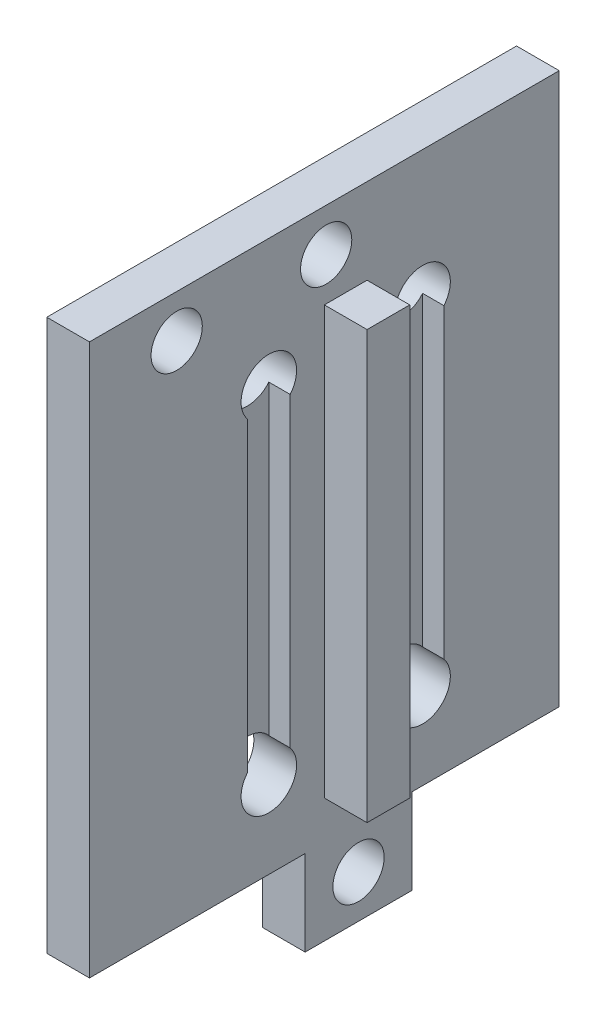
ISO-10303-21;
HEADER;
FILE_DESCRIPTION(('STEP AP214'),'2;1');
FILE_NAME('part.step','',(''),(''),'','','');
FILE_SCHEMA(('AUTOMOTIVE_DESIGN { 1 0 10303 214 1 1 1 1 }'));
ENDSEC;
DATA;
#1=APPLICATION_CONTEXT('core data for automotive mechanical design processes');
#2=APPLICATION_PROTOCOL_DEFINITION('international standard','automotive_design',2000,#1);
#3=PRODUCT_CONTEXT('',#1,'mechanical');
#4=PRODUCT('Part','Part','',(#3));
#5=PRODUCT_RELATED_PRODUCT_CATEGORY('part','',(#4));
#6=PRODUCT_DEFINITION_FORMATION('','',#4);
#7=PRODUCT_DEFINITION_CONTEXT('part definition',#1,'design');
#8=PRODUCT_DEFINITION('design','',#6,#7);
#9=PRODUCT_DEFINITION_SHAPE('','',#8);
#10=(LENGTH_UNIT() NAMED_UNIT(*) SI_UNIT(.MILLI.,.METRE.));
#11=(NAMED_UNIT(*) PLANE_ANGLE_UNIT() SI_UNIT($,.RADIAN.));
#12=(NAMED_UNIT(*) SI_UNIT($,.STERADIAN.) SOLID_ANGLE_UNIT());
#13=UNCERTAINTY_MEASURE_WITH_UNIT(LENGTH_MEASURE(1.E-05),#10,'distance_accuracy_value','');
#14=(GEOMETRIC_REPRESENTATION_CONTEXT(3) GLOBAL_UNCERTAINTY_ASSIGNED_CONTEXT((#13)) GLOBAL_UNIT_ASSIGNED_CONTEXT((#10,
#11,#12)) REPRESENTATION_CONTEXT('',''));
#15=CARTESIAN_POINT('',(0.,0.,0.));
#16=DIRECTION('',(0.,0.,1.));
#17=DIRECTION('',(1.,0.,0.));
#18=AXIS2_PLACEMENT_3D('',#15,#16,#17);
#19=CARTESIAN_POINT('',(1.,-1.,-3.2));
#20=DIRECTION('',(-1.,0.,0.));
#21=DIRECTION('',(0.,0.,1.));
#22=AXIS2_PLACEMENT_3D('',#19,#20,#21);
#23=CYLINDRICAL_SURFACE('',#22,0.65);
#24=CARTESIAN_POINT('',(0.,-1.,-3.2));
#25=DIRECTION('',(1.,0.,0.));
#26=DIRECTION('',(0.,0.,-1.));
#27=AXIS2_PLACEMENT_3D('',#24,#25,#26);
#28=CIRCLE('',#27,0.65);
#29=CARTESIAN_POINT('',(0.,-1.,-3.85));
#30=VERTEX_POINT('',#29);
#31=EDGE_CURVE('E337',#30,#30,#28,.T.);
#32=ORIENTED_EDGE('',*,*,#31,.F.);
#33=EDGE_LOOP('',(#32));
#34=FACE_BOUND('',#33,.T.);
#35=CARTESIAN_POINT('',(0.5,-1.,-3.2));
#36=DIRECTION('',(1.,0.,0.));
#37=DIRECTION('',(0.,0.,-1.));
#38=AXIS2_PLACEMENT_3D('',#35,#36,#37);
#39=CIRCLE('',#38,0.65);
#40=CARTESIAN_POINT('',(0.5,-1.41533119314588,-2.69999999999998));
#41=VERTEX_POINT('',#40);
#42=CARTESIAN_POINT('',(0.5,-1.41533119314588,-3.70000000000002));
#43=VERTEX_POINT('',#42);
#44=EDGE_CURVE('E185',#41,#43,#39,.T.);
#45=ORIENTED_EDGE('',*,*,#44,.T.);
#46=DIRECTION('',(1.,0.,0.));
#47=VECTOR('',#46,1.);
#48=CARTESIAN_POINT('',(0.5,-1.41533119314588,-3.70000000000002));
#49=LINE('',#48,#47);
#50=CARTESIAN_POINT('',(1.,-1.41533119314588,-3.70000000000002));
#51=VERTEX_POINT('',#50);
#52=EDGE_CURVE('E206',#43,#51,#49,.T.);
#53=ORIENTED_EDGE('',*,*,#52,.T.);
#54=CARTESIAN_POINT('',(1.,-1.,-3.2));
#55=DIRECTION('',(1.,0.,0.));
#56=DIRECTION('',(0.,0.,-1.));
#57=AXIS2_PLACEMENT_3D('',#54,#55,#56);
#58=CIRCLE('',#57,0.65);
#59=CARTESIAN_POINT('',(1.,-1.41533119314588,-2.69999999999998));
#60=VERTEX_POINT('',#59);
#61=EDGE_CURVE('E294',#51,#60,#58,.T.);
#62=ORIENTED_EDGE('',*,*,#61,.T.);
#63=DIRECTION('',(1.,0.,0.));
#64=VECTOR('',#63,1.);
#65=CARTESIAN_POINT('',(0.5,-1.41533119314588,-2.69999999999998));
#66=LINE('',#65,#64);
#67=EDGE_CURVE('E52',#41,#60,#66,.T.);
#68=ORIENTED_EDGE('',*,*,#67,.F.);
#69=EDGE_LOOP('',(#45,#53,#62,#68));
#70=FACE_BOUND('',#69,.T.);
#71=ADVANCED_FACE('F37',(#34,#70),#23,.F.);
#72=CARTESIAN_POINT('',(1.,-9.,-3.2));
#73=DIRECTION('',(-1.,0.,0.));
#74=DIRECTION('',(0.,0.,1.));
#75=AXIS2_PLACEMENT_3D('',#72,#73,#74);
#76=CYLINDRICAL_SURFACE('',#75,0.649999999999999);
#77=CARTESIAN_POINT('',(1.,-9.,-3.2));
#78=DIRECTION('',(1.,0.,0.));
#79=DIRECTION('',(0.,0.,-1.));
#80=AXIS2_PLACEMENT_3D('',#77,#78,#79);
#81=CIRCLE('',#80,0.649999999999999);
#82=CARTESIAN_POINT('',(1.,-8.58466880685413,-2.69999999999998));
#83=VERTEX_POINT('',#82);
#84=CARTESIAN_POINT('',(1.,-8.58466880685413,-3.70000000000003));
#85=VERTEX_POINT('',#84);
#86=EDGE_CURVE('E292',#83,#85,#81,.T.);
#87=ORIENTED_EDGE('',*,*,#86,.T.);
#88=DIRECTION('',(-1.,0.,0.));
#89=VECTOR('',#88,1.);
#90=CARTESIAN_POINT('',(1.,-8.58466880685413,-3.70000000000003));
#91=LINE('',#90,#89);
#92=CARTESIAN_POINT('',(0.5,-8.58466880685413,-3.70000000000003));
#93=VERTEX_POINT('',#92);
#94=EDGE_CURVE('E221',#85,#93,#91,.T.);
#95=ORIENTED_EDGE('',*,*,#94,.T.);
#96=CARTESIAN_POINT('',(0.5,-9.,-3.2));
#97=DIRECTION('',(1.,0.,0.));
#98=DIRECTION('',(0.,0.,-1.));
#99=AXIS2_PLACEMENT_3D('',#96,#97,#98);
#100=CIRCLE('',#99,0.649999999999999);
#101=CARTESIAN_POINT('',(0.5,-8.58466880685413,-2.69999999999998));
#102=VERTEX_POINT('',#101);
#103=EDGE_CURVE('E11',#93,#102,#100,.T.);
#104=ORIENTED_EDGE('',*,*,#103,.T.);
#105=DIRECTION('',(-1.,0.,0.));
#106=VECTOR('',#105,1.);
#107=CARTESIAN_POINT('',(1.,-8.58466880685413,-2.69999999999998));
#108=LINE('',#107,#106);
#109=EDGE_CURVE('E199',#83,#102,#108,.T.);
#110=ORIENTED_EDGE('',*,*,#109,.F.);
#111=EDGE_LOOP('',(#87,#95,#104,#110));
#112=FACE_BOUND('',#111,.T.);
#113=CARTESIAN_POINT('',(0.,-9.,-3.2));
#114=DIRECTION('',(1.,0.,0.));
#115=DIRECTION('',(0.,0.,-1.));
#116=AXIS2_PLACEMENT_3D('',#113,#114,#115);
#117=CIRCLE('',#116,0.649999999999999);
#118=CARTESIAN_POINT('',(0.,-9.,-3.85));
#119=VERTEX_POINT('',#118);
#120=EDGE_CURVE('E334',#119,#119,#117,.T.);
#121=ORIENTED_EDGE('',*,*,#120,.F.);
#122=EDGE_LOOP('',(#121));
#123=FACE_BOUND('',#122,.T.);
#124=ADVANCED_FACE('F384',(#112,#123),#76,.F.);
#125=CARTESIAN_POINT('',(1.,-0.999999999999971,-6.8));
#126=DIRECTION('',(-1.,0.,0.));
#127=DIRECTION('',(0.,0.,1.));
#128=AXIS2_PLACEMENT_3D('',#125,#126,#127);
#129=CYLINDRICAL_SURFACE('',#128,0.65);
#130=CARTESIAN_POINT('',(0.,-0.999999999999971,-6.8));
#131=DIRECTION('',(1.,0.,0.));
#132=DIRECTION('',(0.,0.,-1.));
#133=AXIS2_PLACEMENT_3D('',#130,#131,#132);
#134=CIRCLE('',#133,0.65);
#135=CARTESIAN_POINT('',(0.,-0.999999999999971,-7.45));
#136=VERTEX_POINT('',#135);
#137=EDGE_CURVE('E331',#136,#136,#134,.T.);
#138=ORIENTED_EDGE('',*,*,#137,.F.);
#139=EDGE_LOOP('',(#138));
#140=FACE_BOUND('',#139,.T.);
#141=CARTESIAN_POINT('',(0.5,-0.999999999999971,-6.8));
#142=DIRECTION('',(1.,0.,0.));
#143=DIRECTION('',(0.,0.,-1.));
#144=AXIS2_PLACEMENT_3D('',#141,#142,#143);
#145=CIRCLE('',#144,0.65);
#146=CARTESIAN_POINT('',(0.5,-1.41533119314587,-6.3));
#147=VERTEX_POINT('',#146);
#148=CARTESIAN_POINT('',(0.5,-1.41533119314587,-7.3));
#149=VERTEX_POINT('',#148);
#150=EDGE_CURVE('E177',#147,#149,#145,.T.);
#151=ORIENTED_EDGE('',*,*,#150,.T.);
#152=DIRECTION('',(1.,0.,0.));
#153=VECTOR('',#152,1.);
#154=CARTESIAN_POINT('',(0.5,-1.41533119314587,-7.3));
#155=LINE('',#154,#153);
#156=CARTESIAN_POINT('',(1.,-1.41533119314587,-7.3));
#157=VERTEX_POINT('',#156);
#158=EDGE_CURVE('E197',#149,#157,#155,.T.);
#159=ORIENTED_EDGE('',*,*,#158,.T.);
#160=CARTESIAN_POINT('',(1.,-0.999999999999971,-6.8));
#161=DIRECTION('',(1.,0.,0.));
#162=DIRECTION('',(0.,0.,-1.));
#163=AXIS2_PLACEMENT_3D('',#160,#161,#162);
#164=CIRCLE('',#163,0.65);
#165=CARTESIAN_POINT('',(1.,-1.41533119314587,-6.3));
#166=VERTEX_POINT('',#165);
#167=EDGE_CURVE('E196',#157,#166,#164,.T.);
#168=ORIENTED_EDGE('',*,*,#167,.T.);
#169=DIRECTION('',(1.,0.,0.));
#170=VECTOR('',#169,1.);
#171=CARTESIAN_POINT('',(0.5,-1.41533119314587,-6.3));
#172=LINE('',#171,#170);
#173=EDGE_CURVE('E60',#147,#166,#172,.T.);
#174=ORIENTED_EDGE('',*,*,#173,.F.);
#175=EDGE_LOOP('',(#151,#159,#168,#174));
#176=FACE_BOUND('',#175,.T.);
#177=ADVANCED_FACE('F194',(#140,#176),#129,.F.);
#178=CARTESIAN_POINT('',(1.,-9.,-6.8));
#179=DIRECTION('',(-1.,0.,0.));
#180=DIRECTION('',(0.,0.,1.));
#181=AXIS2_PLACEMENT_3D('',#178,#179,#180);
#182=CYLINDRICAL_SURFACE('',#181,0.65);
#183=CARTESIAN_POINT('',(1.,-9.,-6.8));
#184=DIRECTION('',(1.,0.,0.));
#185=DIRECTION('',(0.,0.,-1.));
#186=AXIS2_PLACEMENT_3D('',#183,#184,#185);
#187=CIRCLE('',#186,0.65);
#188=CARTESIAN_POINT('',(1.,-8.5846688068541,-6.3));
#189=VERTEX_POINT('',#188);
#190=CARTESIAN_POINT('',(1.,-8.5846688068541,-7.3));
#191=VERTEX_POINT('',#190);
#192=EDGE_CURVE('E289',#189,#191,#187,.T.);
#193=ORIENTED_EDGE('',*,*,#192,.T.);
#194=DIRECTION('',(-1.,0.,0.));
#195=VECTOR('',#194,1.);
#196=CARTESIAN_POINT('',(1.,-8.5846688068541,-7.3));
#197=LINE('',#196,#195);
#198=CARTESIAN_POINT('',(0.5,-8.5846688068541,-7.3));
#199=VERTEX_POINT('',#198);
#200=EDGE_CURVE('E186',#191,#199,#197,.T.);
#201=ORIENTED_EDGE('',*,*,#200,.T.);
#202=CARTESIAN_POINT('',(0.5,-9.,-6.8));
#203=DIRECTION('',(1.,0.,0.));
#204=DIRECTION('',(0.,0.,-1.));
#205=AXIS2_PLACEMENT_3D('',#202,#203,#204);
#206=CIRCLE('',#205,0.65);
#207=CARTESIAN_POINT('',(0.5,-8.5846688068541,-6.3));
#208=VERTEX_POINT('',#207);
#209=EDGE_CURVE('E45',#199,#208,#206,.T.);
#210=ORIENTED_EDGE('',*,*,#209,.T.);
#211=DIRECTION('',(-1.,0.,0.));
#212=VECTOR('',#211,1.);
#213=CARTESIAN_POINT('',(1.,-8.5846688068541,-6.3));
#214=LINE('',#213,#212);
#215=EDGE_CURVE('E190',#189,#208,#214,.T.);
#216=ORIENTED_EDGE('',*,*,#215,.F.);
#217=EDGE_LOOP('',(#193,#201,#210,#216));
#218=FACE_BOUND('',#217,.T.);
#219=CARTESIAN_POINT('',(0.,-9.,-6.8));
#220=DIRECTION('',(1.,0.,0.));
#221=DIRECTION('',(0.,0.,-1.));
#222=AXIS2_PLACEMENT_3D('',#219,#220,#221);
#223=CIRCLE('',#222,0.65);
#224=CARTESIAN_POINT('',(0.,-9.,-7.45));
#225=VERTEX_POINT('',#224);
#226=EDGE_CURVE('E328',#225,#225,#223,.T.);
#227=ORIENTED_EDGE('',*,*,#226,.F.);
#228=EDGE_LOOP('',(#227));
#229=FACE_BOUND('',#228,.T.);
#230=ADVANCED_FACE('F360',(#218,#229),#182,.F.);
#231=CARTESIAN_POINT('',(1.,0.,0.));
#232=DIRECTION('',(1.,0.,0.));
#233=DIRECTION('',(0.,0.,-1.));
#234=AXIS2_PLACEMENT_3D('',#231,#232,#233);
#235=PLANE('',#234);
#236=DIRECTION('',(0.,0.,1.));
#237=VECTOR('',#236,1.);
#238=CARTESIAN_POINT('',(1.,-10.,0.));
#239=LINE('',#238,#237);
#240=CARTESIAN_POINT('',(1.,-10.,-5.5));
#241=VERTEX_POINT('',#240);
#242=CARTESIAN_POINT('',(1.,-10.,-4.5));
#243=VERTEX_POINT('',#242);
#244=EDGE_CURVE('E229',#241,#243,#239,.T.);
#245=ORIENTED_EDGE('',*,*,#244,.T.);
#246=DIRECTION('',(0.,1.,0.));
#247=VECTOR('',#246,1.);
#248=CARTESIAN_POINT('',(1.,0.,-4.5));
#249=LINE('',#248,#247);
#250=CARTESIAN_POINT('',(1.,0.,-4.5));
#251=VERTEX_POINT('',#250);
#252=EDGE_CURVE('E243',#243,#251,#249,.T.);
#253=ORIENTED_EDGE('',*,*,#252,.T.);
#254=DIRECTION('',(0.,0.,1.));
#255=VECTOR('',#254,1.);
#256=CARTESIAN_POINT('',(1.,0.,0.));
#257=LINE('',#256,#255);
#258=CARTESIAN_POINT('',(1.,0.,-5.5));
#259=VERTEX_POINT('',#258);
#260=EDGE_CURVE('E245',#259,#251,#257,.T.);
#261=ORIENTED_EDGE('',*,*,#260,.F.);
#262=DIRECTION('',(0.,1.,0.));
#263=VECTOR('',#262,1.);
#264=CARTESIAN_POINT('',(1.,0.,-5.5));
#265=LINE('',#264,#263);
#266=EDGE_CURVE('E234',#241,#259,#265,.T.);
#267=ORIENTED_EDGE('',*,*,#266,.F.);
#268=EDGE_LOOP('',(#245,#253,#261,#267));
#269=FACE_BOUND('',#268,.T.);
#270=DIRECTION('',(0.,0.,-1.));
#271=VECTOR('',#270,1.);
#272=CARTESIAN_POINT('',(1.,-10.9,0.));
#273=LINE('',#272,#271);
#274=CARTESIAN_POINT('',(1.,-10.9,-6.55));
#275=VERTEX_POINT('',#274);
#276=CARTESIAN_POINT('',(1.,-10.9,-10.));
#277=VERTEX_POINT('',#276);
#278=EDGE_CURVE('E262',#275,#277,#273,.T.);
#279=ORIENTED_EDGE('',*,*,#278,.T.);
#280=DIRECTION('',(0.,1.,0.));
#281=VECTOR('',#280,1.);
#282=CARTESIAN_POINT('',(1.,0.,-10.));
#283=LINE('',#282,#281);
#284=CARTESIAN_POINT('',(1.,2.,-10.));
#285=VERTEX_POINT('',#284);
#286=EDGE_CURVE('E265',#277,#285,#283,.T.);
#287=ORIENTED_EDGE('',*,*,#286,.T.);
#288=DIRECTION('',(0.,0.,-1.));
#289=VECTOR('',#288,1.);
#290=CARTESIAN_POINT('',(1.,2.,0.));
#291=LINE('',#290,#289);
#292=CARTESIAN_POINT('',(1.,2.,1.));
#293=VERTEX_POINT('',#292);
#294=EDGE_CURVE('E268',#293,#285,#291,.T.);
#295=ORIENTED_EDGE('',*,*,#294,.F.);
#296=DIRECTION('',(0.,-1.,0.));
#297=VECTOR('',#296,1.);
#298=CARTESIAN_POINT('',(1.,0.,1.));
#299=LINE('',#298,#297);
#300=CARTESIAN_POINT('',(1.,-10.9,0.999999999999998));
#301=VERTEX_POINT('',#300);
#302=EDGE_CURVE('E271',#293,#301,#299,.T.);
#303=ORIENTED_EDGE('',*,*,#302,.T.);
#304=DIRECTION('',(0.,0.,1.));
#305=VECTOR('',#304,1.);
#306=CARTESIAN_POINT('',(1.,-10.9,0.));
#307=LINE('',#306,#305);
#308=CARTESIAN_POINT('',(1.,-10.9,-4.05));
#309=VERTEX_POINT('',#308);
#310=EDGE_CURVE('E273',#309,#301,#307,.T.);
#311=ORIENTED_EDGE('',*,*,#310,.F.);
#312=DIRECTION('',(0.,1.,0.));
#313=VECTOR('',#312,1.);
#314=CARTESIAN_POINT('',(1.,0.,-4.05));
#315=LINE('',#314,#313);
#316=CARTESIAN_POINT('',(1.,-12.9,-4.05));
#317=VERTEX_POINT('',#316);
#318=EDGE_CURVE('E276',#317,#309,#315,.T.);
#319=ORIENTED_EDGE('',*,*,#318,.F.);
#320=DIRECTION('',(0.,0.,-1.));
#321=VECTOR('',#320,1.);
#322=CARTESIAN_POINT('',(1.,-12.9,0.));
#323=LINE('',#322,#321);
#324=CARTESIAN_POINT('',(1.,-12.9,-6.55));
#325=VERTEX_POINT('',#324);
#326=EDGE_CURVE('E279',#317,#325,#323,.T.);
#327=ORIENTED_EDGE('',*,*,#326,.T.);
#328=DIRECTION('',(0.,1.,0.));
#329=VECTOR('',#328,1.);
#330=CARTESIAN_POINT('',(1.,0.,-6.55));
#331=LINE('',#330,#329);
#332=EDGE_CURVE('E281',#325,#275,#331,.T.);
#333=ORIENTED_EDGE('',*,*,#332,.T.);
#334=EDGE_LOOP('',(#279,#287,#295,#303,#311,#319,#327,#333));
#335=FACE_BOUND('',#334,.T.);
#336=CARTESIAN_POINT('',(1.,0.999999999999999,-4.54229405691225));
#337=DIRECTION('',(1.,0.,0.));
#338=DIRECTION('',(0.,0.,-1.));
#339=AXIS2_PLACEMENT_3D('',#336,#337,#338);
#340=CIRCLE('',#339,0.6);
#341=CARTESIAN_POINT('',(1.,0.999999999999999,-5.14229405691225));
#342=VERTEX_POINT('',#341);
#343=EDGE_CURVE('E283',#342,#342,#340,.T.);
#344=ORIENTED_EDGE('',*,*,#343,.F.);
#345=EDGE_LOOP('',(#344));
#346=FACE_BOUND('',#345,.T.);
#347=CARTESIAN_POINT('',(1.,1.,-1.04229405691225));
#348=DIRECTION('',(1.,0.,0.));
#349=DIRECTION('',(0.,0.,-1.));
#350=AXIS2_PLACEMENT_3D('',#347,#348,#349);
#351=CIRCLE('',#350,0.6);
#352=CARTESIAN_POINT('',(1.,1.,-1.64229405691225));
#353=VERTEX_POINT('',#352);
#354=EDGE_CURVE('E286',#353,#353,#351,.T.);
#355=ORIENTED_EDGE('',*,*,#354,.F.);
#356=EDGE_LOOP('',(#355));
#357=FACE_BOUND('',#356,.T.);
#358=CARTESIAN_POINT('',(1.,-11.9,-5.3));
#359=DIRECTION('',(1.,0.,0.));
#360=DIRECTION('',(0.,0.,-1.));
#361=AXIS2_PLACEMENT_3D('',#358,#359,#360);
#362=CIRCLE('',#361,0.6);
#363=CARTESIAN_POINT('',(1.,-11.9,-5.9));
#364=VERTEX_POINT('',#363);
#365=EDGE_CURVE('E297',#364,#364,#362,.T.);
#366=ORIENTED_EDGE('',*,*,#365,.F.);
#367=EDGE_LOOP('',(#366));
#368=FACE_BOUND('',#367,.T.);
#369=ORIENTED_EDGE('',*,*,#61,.F.);
#370=DIRECTION('',(0.,-1.,0.));
#371=VECTOR('',#370,1.);
#372=CARTESIAN_POINT('',(1.,-1.41533119314588,-3.70000000000002));
#373=LINE('',#372,#371);
#374=EDGE_CURVE('E209',#51,#85,#373,.T.);
#375=ORIENTED_EDGE('',*,*,#374,.T.);
#376=ORIENTED_EDGE('',*,*,#86,.F.);
#377=DIRECTION('',(0.,-1.,0.));
#378=VECTOR('',#377,1.);
#379=CARTESIAN_POINT('',(1.,-1.41533119314588,-2.69999999999998));
#380=LINE('',#379,#378);
#381=EDGE_CURVE('E212',#60,#83,#380,.T.);
#382=ORIENTED_EDGE('',*,*,#381,.F.);
#383=EDGE_LOOP('',(#369,#375,#376,#382));
#384=FACE_BOUND('',#383,.T.);
#385=ORIENTED_EDGE('',*,*,#167,.F.);
#386=DIRECTION('',(0.,-1.,0.));
#387=VECTOR('',#386,1.);
#388=CARTESIAN_POINT('',(1.,-1.41533119314587,-7.3));
#389=LINE('',#388,#387);
#390=EDGE_CURVE('E191',#157,#191,#389,.T.);
#391=ORIENTED_EDGE('',*,*,#390,.T.);
#392=ORIENTED_EDGE('',*,*,#192,.F.);
#393=DIRECTION('',(0.,-1.,0.));
#394=VECTOR('',#393,1.);
#395=CARTESIAN_POINT('',(1.,-1.41533119314587,-6.3));
#396=LINE('',#395,#394);
#397=EDGE_CURVE('E215',#166,#189,#396,.T.);
#398=ORIENTED_EDGE('',*,*,#397,.F.);
#399=EDGE_LOOP('',(#385,#391,#392,#398));
#400=FACE_BOUND('',#399,.T.);
#401=ADVANCED_FACE('F368',(#269,#335,#346,#357,#368,#384,#400),#235,.T.);
#402=CARTESIAN_POINT('',(1.,-10.9,0.));
#403=DIRECTION('',(0.,1.,0.));
#404=DIRECTION('',(0.,0.,1.));
#405=AXIS2_PLACEMENT_3D('',#402,#403,#404);
#406=PLANE('',#405);
#407=DIRECTION('',(0.,0.,-1.));
#408=VECTOR('',#407,1.);
#409=CARTESIAN_POINT('',(0.,-10.9,0.));
#410=LINE('',#409,#408);
#411=CARTESIAN_POINT('',(0.,-10.9,-6.55));
#412=VERTEX_POINT('',#411);
#413=CARTESIAN_POINT('',(0.,-10.9,-10.));
#414=VERTEX_POINT('',#413);
#415=EDGE_CURVE('E253',#412,#414,#410,.T.);
#416=ORIENTED_EDGE('',*,*,#415,.T.);
#417=DIRECTION('',(-1.,0.,0.));
#418=VECTOR('',#417,1.);
#419=CARTESIAN_POINT('',(1.,-10.9,-10.));
#420=LINE('',#419,#418);
#421=EDGE_CURVE('E357',#277,#414,#420,.T.);
#422=ORIENTED_EDGE('',*,*,#421,.F.);
#423=ORIENTED_EDGE('',*,*,#278,.F.);
#424=DIRECTION('',(-1.,0.,0.));
#425=VECTOR('',#424,1.);
#426=CARTESIAN_POINT('',(1.,-10.9,-6.55));
#427=LINE('',#426,#425);
#428=EDGE_CURVE('E300',#275,#412,#427,.T.);
#429=ORIENTED_EDGE('',*,*,#428,.T.);
#430=EDGE_LOOP('',(#416,#422,#423,#429));
#431=FACE_BOUND('',#430,.T.);
#432=ADVANCED_FACE('F39',(#431),#406,.F.);
#433=CARTESIAN_POINT('',(1.,0.,-10.));
#434=DIRECTION('',(0.,0.,1.));
#435=DIRECTION('',(1.,0.,0.));
#436=AXIS2_PLACEMENT_3D('',#433,#434,#435);
#437=PLANE('',#436);
#438=DIRECTION('',(0.,1.,0.));
#439=VECTOR('',#438,1.);
#440=CARTESIAN_POINT('',(0.,0.,-10.));
#441=LINE('',#440,#439);
#442=CARTESIAN_POINT('',(0.,2.,-10.));
#443=VERTEX_POINT('',#442);
#444=EDGE_CURVE('E303',#414,#443,#441,.T.);
#445=ORIENTED_EDGE('',*,*,#444,.T.);
#446=DIRECTION('',(-1.,0.,0.));
#447=VECTOR('',#446,1.);
#448=CARTESIAN_POINT('',(1.,2.,-10.));
#449=LINE('',#448,#447);
#450=EDGE_CURVE('E355',#285,#443,#449,.T.);
#451=ORIENTED_EDGE('',*,*,#450,.F.);
#452=ORIENTED_EDGE('',*,*,#286,.F.);
#453=ORIENTED_EDGE('',*,*,#421,.T.);
#454=EDGE_LOOP('',(#445,#451,#452,#453));
#455=FACE_BOUND('',#454,.T.);
#456=ADVANCED_FACE('F377',(#455),#437,.F.);
#457=CARTESIAN_POINT('',(1.,2.,0.));
#458=DIRECTION('',(0.,1.,0.));
#459=DIRECTION('',(0.,0.,1.));
#460=AXIS2_PLACEMENT_3D('',#457,#458,#459);
#461=PLANE('',#460);
#462=DIRECTION('',(0.,0.,-1.));
#463=VECTOR('',#462,1.);
#464=CARTESIAN_POINT('',(0.,2.,0.));
#465=LINE('',#464,#463);
#466=CARTESIAN_POINT('',(0.,2.,1.));
#467=VERTEX_POINT('',#466);
#468=EDGE_CURVE('E306',#467,#443,#465,.T.);
#469=ORIENTED_EDGE('',*,*,#468,.F.);
#470=DIRECTION('',(-1.,0.,0.));
#471=VECTOR('',#470,1.);
#472=CARTESIAN_POINT('',(1.,2.,1.));
#473=LINE('',#472,#471);
#474=EDGE_CURVE('E353',#293,#467,#473,.T.);
#475=ORIENTED_EDGE('',*,*,#474,.F.);
#476=ORIENTED_EDGE('',*,*,#294,.T.);
#477=ORIENTED_EDGE('',*,*,#450,.T.);
#478=EDGE_LOOP('',(#469,#475,#476,#477));
#479=FACE_BOUND('',#478,.T.);
#480=ADVANCED_FACE('F427',(#479),#461,.T.);
#481=CARTESIAN_POINT('',(1.,0.,1.));
#482=DIRECTION('',(0.,0.,-1.));
#483=DIRECTION('',(0.,1.,0.));
#484=AXIS2_PLACEMENT_3D('',#481,#482,#483);
#485=PLANE('',#484);
#486=DIRECTION('',(0.,-1.,0.));
#487=VECTOR('',#486,1.);
#488=CARTESIAN_POINT('',(0.,0.,1.));
#489=LINE('',#488,#487);
#490=CARTESIAN_POINT('',(0.,-10.9,0.999999999999998));
#491=VERTEX_POINT('',#490);
#492=EDGE_CURVE('E309',#467,#491,#489,.T.);
#493=ORIENTED_EDGE('',*,*,#492,.T.);
#494=DIRECTION('',(-1.,0.,0.));
#495=VECTOR('',#494,1.);
#496=CARTESIAN_POINT('',(1.,-10.9,0.999999999999998));
#497=LINE('',#496,#495);
#498=EDGE_CURVE('E351',#301,#491,#497,.T.);
#499=ORIENTED_EDGE('',*,*,#498,.F.);
#500=ORIENTED_EDGE('',*,*,#302,.F.);
#501=ORIENTED_EDGE('',*,*,#474,.T.);
#502=EDGE_LOOP('',(#493,#499,#500,#501));
#503=FACE_BOUND('',#502,.T.);
#504=ADVANCED_FACE('F423',(#503),#485,.F.);
#505=CARTESIAN_POINT('',(1.,-10.9,0.));
#506=DIRECTION('',(0.,-1.,0.));
#507=DIRECTION('',(0.,0.,-1.));
#508=AXIS2_PLACEMENT_3D('',#505,#506,#507);
#509=PLANE('',#508);
#510=DIRECTION('',(0.,0.,1.));
#511=VECTOR('',#510,1.);
#512=CARTESIAN_POINT('',(0.,-10.9,0.));
#513=LINE('',#512,#511);
#514=CARTESIAN_POINT('',(0.,-10.9,-4.05));
#515=VERTEX_POINT('',#514);
#516=EDGE_CURVE('E312',#515,#491,#513,.T.);
#517=ORIENTED_EDGE('',*,*,#516,.F.);
#518=DIRECTION('',(-1.,0.,0.));
#519=VECTOR('',#518,1.);
#520=CARTESIAN_POINT('',(1.,-10.9,-4.05));
#521=LINE('',#520,#519);
#522=EDGE_CURVE('E349',#309,#515,#521,.T.);
#523=ORIENTED_EDGE('',*,*,#522,.F.);
#524=ORIENTED_EDGE('',*,*,#310,.T.);
#525=ORIENTED_EDGE('',*,*,#498,.T.);
#526=EDGE_LOOP('',(#517,#523,#524,#525));
#527=FACE_BOUND('',#526,.T.);
#528=ADVANCED_FACE('F419',(#527),#509,.T.);
#529=CARTESIAN_POINT('',(1.,0.,-4.05));
#530=DIRECTION('',(0.,0.,1.));
#531=DIRECTION('',(1.,0.,0.));
#532=AXIS2_PLACEMENT_3D('',#529,#530,#531);
#533=PLANE('',#532);
#534=DIRECTION('',(0.,1.,0.));
#535=VECTOR('',#534,1.);
#536=CARTESIAN_POINT('',(0.,0.,-4.05));
#537=LINE('',#536,#535);
#538=CARTESIAN_POINT('',(0.,-12.9,-4.05));
#539=VERTEX_POINT('',#538);
#540=EDGE_CURVE('E315',#539,#515,#537,.T.);
#541=ORIENTED_EDGE('',*,*,#540,.F.);
#542=DIRECTION('',(-1.,0.,0.));
#543=VECTOR('',#542,1.);
#544=CARTESIAN_POINT('',(1.,-12.9,-4.05));
#545=LINE('',#544,#543);
#546=EDGE_CURVE('E347',#317,#539,#545,.T.);
#547=ORIENTED_EDGE('',*,*,#546,.F.);
#548=ORIENTED_EDGE('',*,*,#318,.T.);
#549=ORIENTED_EDGE('',*,*,#522,.T.);
#550=EDGE_LOOP('',(#541,#547,#548,#549));
#551=FACE_BOUND('',#550,.T.);
#552=ADVANCED_FACE('F415',(#551),#533,.T.);
#553=CARTESIAN_POINT('',(1.,-12.9,0.));
#554=DIRECTION('',(0.,1.,0.));
#555=DIRECTION('',(0.,0.,1.));
#556=AXIS2_PLACEMENT_3D('',#553,#554,#555);
#557=PLANE('',#556);
#558=DIRECTION('',(0.,0.,-1.));
#559=VECTOR('',#558,1.);
#560=CARTESIAN_POINT('',(0.,-12.9,0.));
#561=LINE('',#560,#559);
#562=CARTESIAN_POINT('',(0.,-12.9,-6.55));
#563=VERTEX_POINT('',#562);
#564=EDGE_CURVE('E318',#539,#563,#561,.T.);
#565=ORIENTED_EDGE('',*,*,#564,.T.);
#566=DIRECTION('',(-1.,0.,0.));
#567=VECTOR('',#566,1.);
#568=CARTESIAN_POINT('',(1.,-12.9,-6.55));
#569=LINE('',#568,#567);
#570=EDGE_CURVE('E344',#325,#563,#569,.T.);
#571=ORIENTED_EDGE('',*,*,#570,.F.);
#572=ORIENTED_EDGE('',*,*,#326,.F.);
#573=ORIENTED_EDGE('',*,*,#546,.T.);
#574=EDGE_LOOP('',(#565,#571,#572,#573));
#575=FACE_BOUND('',#574,.T.);
#576=ADVANCED_FACE('F404',(#575),#557,.F.);
#577=CARTESIAN_POINT('',(1.,1.,-1.04229405691225));
#578=DIRECTION('',(-1.,0.,0.));
#579=DIRECTION('',(0.,0.,1.));
#580=AXIS2_PLACEMENT_3D('',#577,#578,#579);
#581=CYLINDRICAL_SURFACE('',#580,0.6);
#582=ORIENTED_EDGE('',*,*,#354,.T.);
#583=EDGE_LOOP('',(#582));
#584=FACE_BOUND('',#583,.T.);
#585=CARTESIAN_POINT('',(0.,1.,-1.04229405691225));
#586=DIRECTION('',(1.,0.,0.));
#587=DIRECTION('',(0.,0.,-1.));
#588=AXIS2_PLACEMENT_3D('',#585,#586,#587);
#589=CIRCLE('',#588,0.6);
#590=CARTESIAN_POINT('',(0.,1.,-1.64229405691225));
#591=VERTEX_POINT('',#590);
#592=EDGE_CURVE('E325',#591,#591,#589,.T.);
#593=ORIENTED_EDGE('',*,*,#592,.F.);
#594=EDGE_LOOP('',(#593));
#595=FACE_BOUND('',#594,.T.);
#596=ADVANCED_FACE('F400',(#584,#595),#581,.F.);
#597=CARTESIAN_POINT('',(1.,0.999999999999999,-4.54229405691225));
#598=DIRECTION('',(-1.,0.,0.));
#599=DIRECTION('',(0.,0.,1.));
#600=AXIS2_PLACEMENT_3D('',#597,#598,#599);
#601=CYLINDRICAL_SURFACE('',#600,0.6);
#602=ORIENTED_EDGE('',*,*,#343,.T.);
#603=EDGE_LOOP('',(#602));
#604=FACE_BOUND('',#603,.T.);
#605=CARTESIAN_POINT('',(0.,0.999999999999999,-4.54229405691225));
#606=DIRECTION('',(1.,0.,0.));
#607=DIRECTION('',(0.,0.,-1.));
#608=AXIS2_PLACEMENT_3D('',#605,#606,#607);
#609=CIRCLE('',#608,0.6);
#610=CARTESIAN_POINT('',(0.,0.999999999999999,-5.14229405691225));
#611=VERTEX_POINT('',#610);
#612=EDGE_CURVE('E322',#611,#611,#609,.T.);
#613=ORIENTED_EDGE('',*,*,#612,.F.);
#614=EDGE_LOOP('',(#613));
#615=FACE_BOUND('',#614,.T.);
#616=ADVANCED_FACE('F403',(#604,#615),#601,.F.);
#617=CARTESIAN_POINT('',(1.,0.,-6.55));
#618=DIRECTION('',(0.,0.,1.));
#619=DIRECTION('',(1.,0.,0.));
#620=AXIS2_PLACEMENT_3D('',#617,#618,#619);
#621=PLANE('',#620);
#622=DIRECTION('',(0.,1.,0.));
#623=VECTOR('',#622,1.);
#624=CARTESIAN_POINT('',(0.,0.,-6.55));
#625=LINE('',#624,#623);
#626=EDGE_CURVE('E320',#563,#412,#625,.T.);
#627=ORIENTED_EDGE('',*,*,#626,.T.);
#628=ORIENTED_EDGE('',*,*,#428,.F.);
#629=ORIENTED_EDGE('',*,*,#332,.F.);
#630=ORIENTED_EDGE('',*,*,#570,.T.);
#631=EDGE_LOOP('',(#627,#628,#629,#630));
#632=FACE_BOUND('',#631,.T.);
#633=ADVANCED_FACE('F408',(#632),#621,.F.);
#634=CARTESIAN_POINT('',(1.,-11.9,-5.3));
#635=DIRECTION('',(-1.,0.,0.));
#636=DIRECTION('',(0.,0.,1.));
#637=AXIS2_PLACEMENT_3D('',#634,#635,#636);
#638=CYLINDRICAL_SURFACE('',#637,0.6);
#639=ORIENTED_EDGE('',*,*,#365,.T.);
#640=EDGE_LOOP('',(#639));
#641=FACE_BOUND('',#640,.T.);
#642=CARTESIAN_POINT('',(0.,-11.9,-5.3));
#643=DIRECTION('',(1.,0.,0.));
#644=DIRECTION('',(0.,0.,-1.));
#645=AXIS2_PLACEMENT_3D('',#642,#643,#644);
#646=CIRCLE('',#645,0.6);
#647=CARTESIAN_POINT('',(0.,-11.9,-5.9));
#648=VERTEX_POINT('',#647);
#649=EDGE_CURVE('E266',#648,#648,#646,.T.);
#650=ORIENTED_EDGE('',*,*,#649,.F.);
#651=EDGE_LOOP('',(#650));
#652=FACE_BOUND('',#651,.T.);
#653=ADVANCED_FACE('F395',(#641,#652),#638,.F.);
#654=CARTESIAN_POINT('',(0.,0.,0.));
#655=DIRECTION('',(1.,0.,0.));
#656=DIRECTION('',(0.,0.,-1.));
#657=AXIS2_PLACEMENT_3D('',#654,#655,#656);
#658=PLANE('',#657);
#659=ORIENTED_EDGE('',*,*,#415,.F.);
#660=ORIENTED_EDGE('',*,*,#626,.F.);
#661=ORIENTED_EDGE('',*,*,#564,.F.);
#662=ORIENTED_EDGE('',*,*,#540,.T.);
#663=ORIENTED_EDGE('',*,*,#516,.T.);
#664=ORIENTED_EDGE('',*,*,#492,.F.);
#665=ORIENTED_EDGE('',*,*,#468,.T.);
#666=ORIENTED_EDGE('',*,*,#444,.F.);
#667=EDGE_LOOP('',(#659,#660,#661,#662,#663,#664,#665,#666));
#668=FACE_BOUND('',#667,.T.);
#669=ORIENTED_EDGE('',*,*,#612,.T.);
#670=EDGE_LOOP('',(#669));
#671=FACE_BOUND('',#670,.T.);
#672=ORIENTED_EDGE('',*,*,#592,.T.);
#673=EDGE_LOOP('',(#672));
#674=FACE_BOUND('',#673,.T.);
#675=ORIENTED_EDGE('',*,*,#226,.T.);
#676=EDGE_LOOP('',(#675));
#677=FACE_BOUND('',#676,.T.);
#678=ORIENTED_EDGE('',*,*,#137,.T.);
#679=EDGE_LOOP('',(#678));
#680=FACE_BOUND('',#679,.T.);
#681=ORIENTED_EDGE('',*,*,#120,.T.);
#682=EDGE_LOOP('',(#681));
#683=FACE_BOUND('',#682,.T.);
#684=ORIENTED_EDGE('',*,*,#31,.T.);
#685=EDGE_LOOP('',(#684));
#686=FACE_BOUND('',#685,.T.);
#687=ORIENTED_EDGE('',*,*,#649,.T.);
#688=EDGE_LOOP('',(#687));
#689=FACE_BOUND('',#688,.T.);
#690=ADVANCED_FACE('F441',(#668,#671,#674,#677,#680,#683,#686,#689),#658,.F.);
#691=CARTESIAN_POINT('',(2.,-10.,0.));
#692=DIRECTION('',(0.,-1.,0.));
#693=DIRECTION('',(0.,0.,-1.));
#694=AXIS2_PLACEMENT_3D('',#691,#692,#693);
#695=PLANE('',#694);
#696=ORIENTED_EDGE('',*,*,#244,.F.);
#697=DIRECTION('',(-1.,0.,0.));
#698=VECTOR('',#697,1.);
#699=CARTESIAN_POINT('',(2.,-10.,-5.5));
#700=LINE('',#699,#698);
#701=CARTESIAN_POINT('',(2.,-10.,-5.5));
#702=VERTEX_POINT('',#701);
#703=EDGE_CURVE('E250',#702,#241,#700,.T.);
#704=ORIENTED_EDGE('',*,*,#703,.F.);
#705=DIRECTION('',(0.,0.,1.));
#706=VECTOR('',#705,1.);
#707=CARTESIAN_POINT('',(2.,-10.,0.));
#708=LINE('',#707,#706);
#709=CARTESIAN_POINT('',(2.,-10.,-4.5));
#710=VERTEX_POINT('',#709);
#711=EDGE_CURVE('E230',#702,#710,#708,.T.);
#712=ORIENTED_EDGE('',*,*,#711,.T.);
#713=DIRECTION('',(-1.,0.,0.));
#714=VECTOR('',#713,1.);
#715=CARTESIAN_POINT('',(2.,-10.,-4.5));
#716=LINE('',#715,#714);
#717=EDGE_CURVE('E241',#710,#243,#716,.T.);
#718=ORIENTED_EDGE('',*,*,#717,.T.);
#719=EDGE_LOOP('',(#696,#704,#712,#718));
#720=FACE_BOUND('',#719,.T.);
#721=ADVANCED_FACE('F495',(#720),#695,.T.);
#722=CARTESIAN_POINT('',(2.,0.,-5.5));
#723=DIRECTION('',(0.,0.,1.));
#724=DIRECTION('',(0.,-1.,0.));
#725=AXIS2_PLACEMENT_3D('',#722,#723,#724);
#726=PLANE('',#725);
#727=ORIENTED_EDGE('',*,*,#266,.T.);
#728=DIRECTION('',(-1.,0.,0.));
#729=VECTOR('',#728,1.);
#730=CARTESIAN_POINT('',(2.,0.,-5.5));
#731=LINE('',#730,#729);
#732=CARTESIAN_POINT('',(2.,0.,-5.5));
#733=VERTEX_POINT('',#732);
#734=EDGE_CURVE('E254',#733,#259,#731,.T.);
#735=ORIENTED_EDGE('',*,*,#734,.F.);
#736=DIRECTION('',(0.,1.,0.));
#737=VECTOR('',#736,1.);
#738=CARTESIAN_POINT('',(2.,0.,-5.5));
#739=LINE('',#738,#737);
#740=EDGE_CURVE('E239',#702,#733,#739,.T.);
#741=ORIENTED_EDGE('',*,*,#740,.F.);
#742=ORIENTED_EDGE('',*,*,#703,.T.);
#743=EDGE_LOOP('',(#727,#735,#741,#742));
#744=FACE_BOUND('',#743,.T.);
#745=ADVANCED_FACE('F491',(#744),#726,.F.);
#746=CARTESIAN_POINT('',(2.,0.,0.));
#747=DIRECTION('',(0.,-1.,0.));
#748=DIRECTION('',(0.,0.,-1.));
#749=AXIS2_PLACEMENT_3D('',#746,#747,#748);
#750=PLANE('',#749);
#751=ORIENTED_EDGE('',*,*,#260,.T.);
#752=DIRECTION('',(-1.,0.,0.));
#753=VECTOR('',#752,1.);
#754=CARTESIAN_POINT('',(2.,0.,-4.5));
#755=LINE('',#754,#753);
#756=CARTESIAN_POINT('',(2.,0.,-4.5));
#757=VERTEX_POINT('',#756);
#758=EDGE_CURVE('E257',#757,#251,#755,.T.);
#759=ORIENTED_EDGE('',*,*,#758,.F.);
#760=DIRECTION('',(0.,0.,1.));
#761=VECTOR('',#760,1.);
#762=CARTESIAN_POINT('',(2.,0.,0.));
#763=LINE('',#762,#761);
#764=EDGE_CURVE('E237',#733,#757,#763,.T.);
#765=ORIENTED_EDGE('',*,*,#764,.F.);
#766=ORIENTED_EDGE('',*,*,#734,.T.);
#767=EDGE_LOOP('',(#751,#759,#765,#766));
#768=FACE_BOUND('',#767,.T.);
#769=ADVANCED_FACE('F494',(#768),#750,.F.);
#770=CARTESIAN_POINT('',(2.,0.,-4.5));
#771=DIRECTION('',(0.,0.,1.));
#772=DIRECTION('',(0.,-1.,0.));
#773=AXIS2_PLACEMENT_3D('',#770,#771,#772);
#774=PLANE('',#773);
#775=ORIENTED_EDGE('',*,*,#252,.F.);
#776=ORIENTED_EDGE('',*,*,#717,.F.);
#777=DIRECTION('',(0.,1.,0.));
#778=VECTOR('',#777,1.);
#779=CARTESIAN_POINT('',(2.,0.,-4.5));
#780=LINE('',#779,#778);
#781=EDGE_CURVE('E233',#710,#757,#780,.T.);
#782=ORIENTED_EDGE('',*,*,#781,.T.);
#783=ORIENTED_EDGE('',*,*,#758,.T.);
#784=EDGE_LOOP('',(#775,#776,#782,#783));
#785=FACE_BOUND('',#784,.T.);
#786=ADVANCED_FACE('F489',(#785),#774,.T.);
#787=CARTESIAN_POINT('',(2.,0.,0.));
#788=DIRECTION('',(-1.,0.,0.));
#789=DIRECTION('',(0.,0.,1.));
#790=AXIS2_PLACEMENT_3D('',#787,#788,#789);
#791=PLANE('',#790);
#792=ORIENTED_EDGE('',*,*,#711,.F.);
#793=ORIENTED_EDGE('',*,*,#740,.T.);
#794=ORIENTED_EDGE('',*,*,#764,.T.);
#795=ORIENTED_EDGE('',*,*,#781,.F.);
#796=EDGE_LOOP('',(#792,#793,#794,#795));
#797=FACE_BOUND('',#796,.T.);
#798=ADVANCED_FACE('F482',(#797),#791,.F.);
#799=CARTESIAN_POINT('',(0.5,-1.41533119314588,-3.70000000000002));
#800=DIRECTION('',(0.,0.,1.));
#801=DIRECTION('',(0.,-1.,0.));
#802=AXIS2_PLACEMENT_3D('',#799,#800,#801);
#803=PLANE('',#802);
#804=ORIENTED_EDGE('',*,*,#374,.F.);
#805=ORIENTED_EDGE('',*,*,#52,.F.);
#806=DIRECTION('',(0.,-1.,0.));
#807=VECTOR('',#806,1.);
#808=CARTESIAN_POINT('',(0.5,-1.41533119314588,-3.70000000000002));
#809=LINE('',#808,#807);
#810=EDGE_CURVE('E205',#43,#93,#809,.T.);
#811=ORIENTED_EDGE('',*,*,#810,.T.);
#812=ORIENTED_EDGE('',*,*,#94,.F.);
#813=EDGE_LOOP('',(#804,#805,#811,#812));
#814=FACE_BOUND('',#813,.T.);
#815=ADVANCED_FACE('F468',(#814),#803,.T.);
#816=CARTESIAN_POINT('',(0.5,-1.41533119314588,-2.69999999999998));
#817=DIRECTION('',(0.,0.,1.));
#818=DIRECTION('',(0.,-1.,0.));
#819=AXIS2_PLACEMENT_3D('',#816,#817,#818);
#820=PLANE('',#819);
#821=ORIENTED_EDGE('',*,*,#109,.T.);
#822=DIRECTION('',(0.,-1.,0.));
#823=VECTOR('',#822,1.);
#824=CARTESIAN_POINT('',(0.5,-1.41533119314588,-2.69999999999998));
#825=LINE('',#824,#823);
#826=EDGE_CURVE('E213',#41,#102,#825,.T.);
#827=ORIENTED_EDGE('',*,*,#826,.F.);
#828=ORIENTED_EDGE('',*,*,#67,.T.);
#829=ORIENTED_EDGE('',*,*,#381,.T.);
#830=EDGE_LOOP('',(#821,#827,#828,#829));
#831=FACE_BOUND('',#830,.T.);
#832=ADVANCED_FACE('F474',(#831),#820,.F.);
#833=CARTESIAN_POINT('',(0.5,0.,0.));
#834=DIRECTION('',(1.,0.,0.));
#835=DIRECTION('',(0.,0.,-1.));
#836=AXIS2_PLACEMENT_3D('',#833,#834,#835);
#837=PLANE('',#836);
#838=ORIENTED_EDGE('',*,*,#826,.T.);
#839=ORIENTED_EDGE('',*,*,#103,.F.);
#840=ORIENTED_EDGE('',*,*,#810,.F.);
#841=ORIENTED_EDGE('',*,*,#44,.F.);
#842=EDGE_LOOP('',(#838,#839,#840,#841));
#843=FACE_BOUND('',#842,.T.);
#844=ADVANCED_FACE('F471',(#843),#837,.T.);
#845=CARTESIAN_POINT('',(0.5,-1.41533119314587,-7.3));
#846=DIRECTION('',(0.,0.,1.));
#847=DIRECTION('',(0.,-1.,0.));
#848=AXIS2_PLACEMENT_3D('',#845,#846,#847);
#849=PLANE('',#848);
#850=ORIENTED_EDGE('',*,*,#390,.F.);
#851=ORIENTED_EDGE('',*,*,#158,.F.);
#852=DIRECTION('',(0.,-1.,0.));
#853=VECTOR('',#852,1.);
#854=CARTESIAN_POINT('',(0.5,-1.41533119314587,-7.3));
#855=LINE('',#854,#853);
#856=EDGE_CURVE('E182',#149,#199,#855,.T.);
#857=ORIENTED_EDGE('',*,*,#856,.T.);
#858=ORIENTED_EDGE('',*,*,#200,.F.);
#859=EDGE_LOOP('',(#850,#851,#857,#858));
#860=FACE_BOUND('',#859,.T.);
#861=ADVANCED_FACE('F365',(#860),#849,.T.);
#862=CARTESIAN_POINT('',(0.5,-1.41533119314587,-6.3));
#863=DIRECTION('',(0.,0.,1.));
#864=DIRECTION('',(0.,-1.,0.));
#865=AXIS2_PLACEMENT_3D('',#862,#863,#864);
#866=PLANE('',#865);
#867=ORIENTED_EDGE('',*,*,#215,.T.);
#868=DIRECTION('',(0.,-1.,0.));
#869=VECTOR('',#868,1.);
#870=CARTESIAN_POINT('',(0.5,-1.41533119314587,-6.3));
#871=LINE('',#870,#869);
#872=EDGE_CURVE('E179',#147,#208,#871,.T.);
#873=ORIENTED_EDGE('',*,*,#872,.F.);
#874=ORIENTED_EDGE('',*,*,#173,.T.);
#875=ORIENTED_EDGE('',*,*,#397,.T.);
#876=EDGE_LOOP('',(#867,#873,#874,#875));
#877=FACE_BOUND('',#876,.T.);
#878=ADVANCED_FACE('F188',(#877),#866,.F.);
#879=CARTESIAN_POINT('',(0.5,0.,0.));
#880=DIRECTION('',(1.,0.,0.));
#881=DIRECTION('',(0.,0.,-1.));
#882=AXIS2_PLACEMENT_3D('',#879,#880,#881);
#883=PLANE('',#882);
#884=ORIENTED_EDGE('',*,*,#872,.T.);
#885=ORIENTED_EDGE('',*,*,#209,.F.);
#886=ORIENTED_EDGE('',*,*,#856,.F.);
#887=ORIENTED_EDGE('',*,*,#150,.F.);
#888=EDGE_LOOP('',(#884,#885,#886,#887));
#889=FACE_BOUND('',#888,.T.);
#890=ADVANCED_FACE('F178',(#889),#883,.T.);
#891=CLOSED_SHELL('',(#71,#124,#177,#230,#401,#432,#456,#480,#504,#528,#552,#576,#596,#616,#633,
#653,#690,#721,#745,#769,#786,#798,#815,#832,#844,#861,#878,#890));
#892=MANIFOLD_SOLID_BREP('B2',#891);
#893=ADVANCED_BREP_SHAPE_REPRESENTATION('',(#18,#892),#14);
#894=SHAPE_DEFINITION_REPRESENTATION(#9,#893);
ENDSEC;
END-ISO-10303-21;
